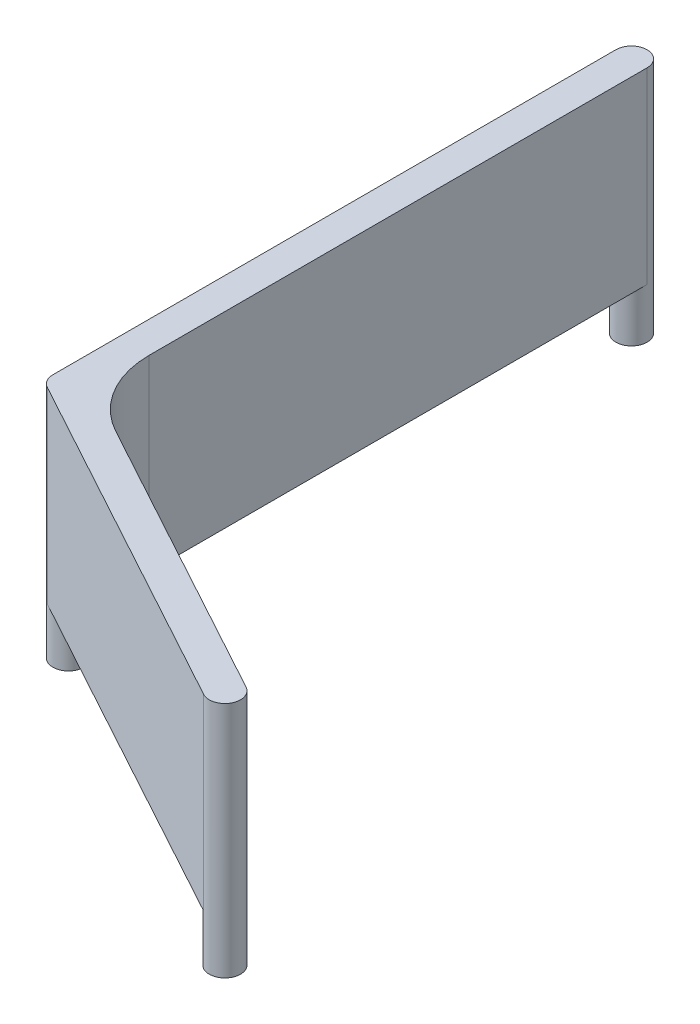
ISO-10303-21;
HEADER;
FILE_DESCRIPTION(('STEP AP214'),'2;1');
FILE_NAME('part.step','',(''),(''),'','','');
FILE_SCHEMA(('AUTOMOTIVE_DESIGN { 1 0 10303 214 1 1 1 1 }'));
ENDSEC;
DATA;
#1=APPLICATION_CONTEXT('core data for automotive mechanical design processes');
#2=APPLICATION_PROTOCOL_DEFINITION('international standard','automotive_design',2000,#1);
#3=PRODUCT_CONTEXT('',#1,'mechanical');
#4=PRODUCT('Part','Part','',(#3));
#5=PRODUCT_RELATED_PRODUCT_CATEGORY('part','',(#4));
#6=PRODUCT_DEFINITION_FORMATION('','',#4);
#7=PRODUCT_DEFINITION_CONTEXT('part definition',#1,'design');
#8=PRODUCT_DEFINITION('design','',#6,#7);
#9=PRODUCT_DEFINITION_SHAPE('','',#8);
#10=(LENGTH_UNIT() NAMED_UNIT(*) SI_UNIT(.MILLI.,.METRE.));
#11=(NAMED_UNIT(*) PLANE_ANGLE_UNIT() SI_UNIT($,.RADIAN.));
#12=(NAMED_UNIT(*) SI_UNIT($,.STERADIAN.) SOLID_ANGLE_UNIT());
#13=UNCERTAINTY_MEASURE_WITH_UNIT(LENGTH_MEASURE(1.E-05),#10,'distance_accuracy_value','');
#14=(GEOMETRIC_REPRESENTATION_CONTEXT(3) GLOBAL_UNCERTAINTY_ASSIGNED_CONTEXT((#13)) GLOBAL_UNIT_ASSIGNED_CONTEXT((#10,
#11,#12)) REPRESENTATION_CONTEXT('',''));
#15=CARTESIAN_POINT('',(0.,0.,0.));
#16=DIRECTION('',(0.,0.,1.));
#17=DIRECTION('',(1.,0.,0.));
#18=AXIS2_PLACEMENT_3D('',#15,#16,#17);
#19=CARTESIAN_POINT('',(0.,0.,0.));
#20=DIRECTION('',(0.,1.,0.));
#21=DIRECTION('',(0.,0.,1.));
#22=AXIS2_PLACEMENT_3D('',#19,#20,#21);
#23=PLANE('',#22);
#24=CARTESIAN_POINT('',(69.85,0.,38.1));
#25=DIRECTION('',(0.,-1.,0.));
#26=DIRECTION('',(0.,0.,-1.));
#27=AXIS2_PLACEMENT_3D('',#24,#25,#26);
#28=CIRCLE('',#27,3.175);
#29=CARTESIAN_POINT('',(68.3296444850892,0.,40.8873184440032));
#30=VERTEX_POINT('',#29);
#31=CARTESIAN_POINT('',(71.3703555149108,0.,35.3126815559968));
#32=VERTEX_POINT('',#31);
#33=EDGE_CURVE('E103',#30,#32,#28,.T.);
#34=ORIENTED_EDGE('',*,*,#33,.F.);
#35=DIRECTION('',(0.877895572914384,0.,0.478852130680573));
#36=VECTOR('',#35,1.);
#37=CARTESIAN_POINT('',(-1.52035551491082,0.,2.78731844400317));
#38=LINE('',#37,#36);
#39=CARTESIAN_POINT('',(-1.52035551491082,0.,2.78731844400317));
#40=VERTEX_POINT('',#39);
#41=EDGE_CURVE('E105',#40,#30,#38,.T.);
#42=ORIENTED_EDGE('',*,*,#41,.F.);
#43=CARTESIAN_POINT('',(0.,0.,0.));
#44=DIRECTION('',(0.,-1.,0.));
#45=DIRECTION('',(0.,0.,-1.));
#46=AXIS2_PLACEMENT_3D('',#43,#44,#45);
#47=CIRCLE('',#46,3.175);
#48=CARTESIAN_POINT('',(-3.175,0.,0.));
#49=VERTEX_POINT('',#48);
#50=EDGE_CURVE('E208',#49,#40,#47,.T.);
#51=ORIENTED_EDGE('',*,*,#50,.F.);
#52=DIRECTION('',(0.,0.,1.));
#53=VECTOR('',#52,1.);
#54=CARTESIAN_POINT('',(-3.175,0.,0.));
#55=LINE('',#54,#53);
#56=CARTESIAN_POINT('',(-3.175,0.,-114.3));
#57=VERTEX_POINT('',#56);
#58=EDGE_CURVE('E158',#57,#49,#55,.T.);
#59=ORIENTED_EDGE('',*,*,#58,.F.);
#60=CARTESIAN_POINT('',(0.,0.,-114.3));
#61=DIRECTION('',(0.,-1.,0.));
#62=DIRECTION('',(0.,0.,-1.));
#63=AXIS2_PLACEMENT_3D('',#60,#61,#62);
#64=CIRCLE('',#63,3.175);
#65=CARTESIAN_POINT('',(3.175,0.,-114.3));
#66=VERTEX_POINT('',#65);
#67=EDGE_CURVE('E155',#66,#57,#64,.T.);
#68=ORIENTED_EDGE('',*,*,#67,.F.);
#69=DIRECTION('',(0.,0.,-1.));
#70=VECTOR('',#69,1.);
#71=CARTESIAN_POINT('',(3.175,0.,-1.88478508849998));
#72=LINE('',#71,#70);
#73=CARTESIAN_POINT('',(3.175,0.,-13.1934956194999));
#74=VERTEX_POINT('',#73);
#75=EDGE_CURVE('E149',#74,#66,#72,.T.);
#76=ORIENTED_EDGE('',*,*,#75,.F.);
#77=CARTESIAN_POINT('',(22.225,0.,-13.1934956194999));
#78=DIRECTION('',(0.,1.,0.));
#79=DIRECTION('',(0.,0.,1.));
#80=AXIS2_PLACEMENT_3D('',#77,#78,#79);
#81=CIRCLE('',#80,19.05);
#82=CARTESIAN_POINT('',(13.1028669105351,0.,3.53041504451916));
#83=VERTEX_POINT('',#82);
#84=EDGE_CURVE('E48',#74,#83,#81,.T.);
#85=ORIENTED_EDGE('',*,*,#84,.T.);
#86=DIRECTION('',(-0.877895572914384,0.,-0.478852130680573));
#87=VECTOR('',#86,1.);
#88=CARTESIAN_POINT('',(3.175,0.,-1.88478508849998));
#89=LINE('',#88,#87);
#90=EDGE_CURVE('E107',#32,#83,#89,.T.);
#91=ORIENTED_EDGE('',*,*,#90,.F.);
#92=EDGE_LOOP('',(#34,#42,#51,#59,#68,#76,#85,#91));
#93=FACE_BOUND('',#92,.T.);
#94=ADVANCED_FACE('F39',(#93),#23,.F.);
#95=CARTESIAN_POINT('',(0.,38.1,0.));
#96=DIRECTION('',(0.,-1.,0.));
#97=DIRECTION('',(0.,0.,-1.));
#98=AXIS2_PLACEMENT_3D('',#95,#96,#97);
#99=CYLINDRICAL_SURFACE('',#98,3.175);
#100=DIRECTION('',(0.,-1.,0.));
#101=VECTOR('',#100,1.);
#102=CARTESIAN_POINT('',(-3.175,38.1,0.));
#103=LINE('',#102,#101);
#104=CARTESIAN_POINT('',(-3.175,38.1,0.));
#105=VERTEX_POINT('',#104);
#106=EDGE_CURVE('E167',#105,#49,#103,.T.);
#107=ORIENTED_EDGE('',*,*,#106,.T.);
#108=ORIENTED_EDGE('',*,*,#50,.T.);
#109=DIRECTION('',(0.,-1.,0.));
#110=VECTOR('',#109,1.);
#111=CARTESIAN_POINT('',(-1.52035551491082,38.1,2.78731844400317));
#112=LINE('',#111,#110);
#113=CARTESIAN_POINT('',(-1.52035551491082,38.1,2.78731844400317));
#114=VERTEX_POINT('',#113);
#115=EDGE_CURVE('E121',#114,#40,#112,.T.);
#116=ORIENTED_EDGE('',*,*,#115,.F.);
#117=CARTESIAN_POINT('',(0.,38.1,0.));
#118=DIRECTION('',(0.,1.,0.));
#119=DIRECTION('',(0.,0.,1.));
#120=AXIS2_PLACEMENT_3D('',#117,#118,#119);
#121=CIRCLE('',#120,3.175);
#122=EDGE_CURVE('E163',#105,#114,#121,.T.);
#123=ORIENTED_EDGE('',*,*,#122,.F.);
#124=EDGE_LOOP('',(#107,#108,#116,#123));
#125=FACE_BOUND('',#124,.T.);
#126=CARTESIAN_POINT('',(0.,-10.16,0.));
#127=DIRECTION('',(0.,-1.,0.));
#128=DIRECTION('',(0.,0.,-1.));
#129=AXIS2_PLACEMENT_3D('',#126,#127,#128);
#130=CIRCLE('',#129,3.175);
#131=CARTESIAN_POINT('',(0.,-10.16,-3.175));
#132=VERTEX_POINT('',#131);
#133=EDGE_CURVE('E204',#132,#132,#130,.T.);
#134=ORIENTED_EDGE('',*,*,#133,.F.);
#135=EDGE_LOOP('',(#134));
#136=FACE_BOUND('',#135,.T.);
#137=ADVANCED_FACE('F227',(#125,#136),#99,.T.);
#138=CARTESIAN_POINT('',(-1.52035551491082,38.1,2.78731844400317));
#139=DIRECTION('',(0.478852130680573,0.,-0.877895572914384));
#140=DIRECTION('',(-0.877895572914384,0.,-0.478852130680573));
#141=AXIS2_PLACEMENT_3D('',#138,#139,#140);
#142=PLANE('',#141);
#143=ORIENTED_EDGE('',*,*,#41,.T.);
#144=DIRECTION('',(0.,-1.,0.));
#145=VECTOR('',#144,1.);
#146=CARTESIAN_POINT('',(68.3296444850892,38.1,40.8873184440032));
#147=LINE('',#146,#145);
#148=CARTESIAN_POINT('',(68.3296444850892,38.1,40.8873184440032));
#149=VERTEX_POINT('',#148);
#150=EDGE_CURVE('E118',#149,#30,#147,.T.);
#151=ORIENTED_EDGE('',*,*,#150,.F.);
#152=DIRECTION('',(0.877895572914384,0.,0.478852130680573));
#153=VECTOR('',#152,1.);
#154=CARTESIAN_POINT('',(-1.52035551491082,38.1,2.78731844400317));
#155=LINE('',#154,#153);
#156=EDGE_CURVE('E196',#114,#149,#155,.T.);
#157=ORIENTED_EDGE('',*,*,#156,.F.);
#158=ORIENTED_EDGE('',*,*,#115,.T.);
#159=EDGE_LOOP('',(#143,#151,#157,#158));
#160=FACE_BOUND('',#159,.T.);
#161=ADVANCED_FACE('F117',(#160),#142,.F.);
#162=CARTESIAN_POINT('',(69.85,38.1,38.1));
#163=DIRECTION('',(0.,-1.,0.));
#164=DIRECTION('',(0.,0.,-1.));
#165=AXIS2_PLACEMENT_3D('',#162,#163,#164);
#166=CYLINDRICAL_SURFACE('',#165,3.175);
#167=ORIENTED_EDGE('',*,*,#150,.T.);
#168=ORIENTED_EDGE('',*,*,#33,.T.);
#169=DIRECTION('',(0.,-1.,0.));
#170=VECTOR('',#169,1.);
#171=CARTESIAN_POINT('',(71.3703555149108,38.1,35.3126815559968));
#172=LINE('',#171,#170);
#173=CARTESIAN_POINT('',(71.3703555149108,38.1,35.3126815559968));
#174=VERTEX_POINT('',#173);
#175=EDGE_CURVE('E129',#174,#32,#172,.T.);
#176=ORIENTED_EDGE('',*,*,#175,.F.);
#177=CARTESIAN_POINT('',(69.85,38.1,38.1));
#178=DIRECTION('',(0.,1.,0.));
#179=DIRECTION('',(0.,0.,1.));
#180=AXIS2_PLACEMENT_3D('',#177,#178,#179);
#181=CIRCLE('',#180,3.175);
#182=EDGE_CURVE('E127',#149,#174,#181,.T.);
#183=ORIENTED_EDGE('',*,*,#182,.F.);
#184=EDGE_LOOP('',(#167,#168,#176,#183));
#185=FACE_BOUND('',#184,.T.);
#186=CARTESIAN_POINT('',(69.85,-10.16,38.1));
#187=DIRECTION('',(0.,-1.,0.));
#188=DIRECTION('',(0.,0.,-1.));
#189=AXIS2_PLACEMENT_3D('',#186,#187,#188);
#190=CIRCLE('',#189,3.175);
#191=CARTESIAN_POINT('',(69.85,-10.16,34.925));
#192=VERTEX_POINT('',#191);
#193=EDGE_CURVE('E113',#192,#192,#190,.T.);
#194=ORIENTED_EDGE('',*,*,#193,.F.);
#195=EDGE_LOOP('',(#194));
#196=FACE_BOUND('',#195,.T.);
#197=ADVANCED_FACE('F125',(#185,#196),#166,.T.);
#198=CARTESIAN_POINT('',(3.175,38.1,-1.88478508849998));
#199=DIRECTION('',(-0.478852130680573,0.,0.877895572914384));
#200=DIRECTION('',(0.877895572914384,0.,0.478852130680573));
#201=AXIS2_PLACEMENT_3D('',#198,#199,#200);
#202=PLANE('',#201);
#203=ORIENTED_EDGE('',*,*,#90,.T.);
#204=DIRECTION('',(0.,-1.,0.));
#205=VECTOR('',#204,1.);
#206=CARTESIAN_POINT('',(13.1028669105351,38.1,3.53041504451916));
#207=LINE('',#206,#205);
#208=CARTESIAN_POINT('',(13.1028669105351,38.1,3.53041504451916));
#209=VERTEX_POINT('',#208);
#210=EDGE_CURVE('E55',#83,#209,#207,.F.);
#211=ORIENTED_EDGE('',*,*,#210,.T.);
#212=DIRECTION('',(-0.877895572914384,0.,-0.478852130680573));
#213=VECTOR('',#212,1.);
#214=CARTESIAN_POINT('',(3.175,38.1,-1.88478508849998));
#215=LINE('',#214,#213);
#216=EDGE_CURVE('E189',#174,#209,#215,.T.);
#217=ORIENTED_EDGE('',*,*,#216,.F.);
#218=ORIENTED_EDGE('',*,*,#175,.T.);
#219=EDGE_LOOP('',(#203,#211,#217,#218));
#220=FACE_BOUND('',#219,.T.);
#221=ADVANCED_FACE('F220',(#220),#202,.F.);
#222=CARTESIAN_POINT('',(3.175,38.1,-1.88478508849998));
#223=DIRECTION('',(-1.,0.,0.));
#224=DIRECTION('',(0.,0.,1.));
#225=AXIS2_PLACEMENT_3D('',#222,#223,#224);
#226=PLANE('',#225);
#227=DIRECTION('',(0.,0.,-1.));
#228=VECTOR('',#227,1.);
#229=CARTESIAN_POINT('',(3.175,38.1,-1.88478508849998));
#230=LINE('',#229,#228);
#231=CARTESIAN_POINT('',(3.175,38.1,-13.1934956194999));
#232=VERTEX_POINT('',#231);
#233=CARTESIAN_POINT('',(3.175,38.1,-114.3));
#234=VERTEX_POINT('',#233);
#235=EDGE_CURVE('E151',#232,#234,#230,.T.);
#236=ORIENTED_EDGE('',*,*,#235,.F.);
#237=DIRECTION('',(0.,-1.,0.));
#238=VECTOR('',#237,1.);
#239=CARTESIAN_POINT('',(3.17500000000001,0.,-13.1934956194999));
#240=LINE('',#239,#238);
#241=EDGE_CURVE('E133',#232,#74,#240,.T.);
#242=ORIENTED_EDGE('',*,*,#241,.T.);
#243=ORIENTED_EDGE('',*,*,#75,.T.);
#244=DIRECTION('',(0.,-1.,0.));
#245=VECTOR('',#244,1.);
#246=CARTESIAN_POINT('',(3.175,38.1,-114.3));
#247=LINE('',#246,#245);
#248=EDGE_CURVE('E135',#234,#66,#247,.T.);
#249=ORIENTED_EDGE('',*,*,#248,.F.);
#250=EDGE_LOOP('',(#236,#242,#243,#249));
#251=FACE_BOUND('',#250,.T.);
#252=ADVANCED_FACE('F147',(#251),#226,.F.);
#253=CARTESIAN_POINT('',(0.,38.1,-114.3));
#254=DIRECTION('',(0.,-1.,0.));
#255=DIRECTION('',(0.,0.,-1.));
#256=AXIS2_PLACEMENT_3D('',#253,#254,#255);
#257=CYLINDRICAL_SURFACE('',#256,3.175);
#258=ORIENTED_EDGE('',*,*,#248,.T.);
#259=ORIENTED_EDGE('',*,*,#67,.T.);
#260=DIRECTION('',(0.,-1.,0.));
#261=VECTOR('',#260,1.);
#262=CARTESIAN_POINT('',(-3.175,38.1,-114.3));
#263=LINE('',#262,#261);
#264=CARTESIAN_POINT('',(-3.175,38.1,-114.3));
#265=VERTEX_POINT('',#264);
#266=EDGE_CURVE('E171',#265,#57,#263,.T.);
#267=ORIENTED_EDGE('',*,*,#266,.F.);
#268=CARTESIAN_POINT('',(0.,38.1,-114.3));
#269=DIRECTION('',(0.,1.,0.));
#270=DIRECTION('',(0.,0.,1.));
#271=AXIS2_PLACEMENT_3D('',#268,#269,#270);
#272=CIRCLE('',#271,3.175);
#273=EDGE_CURVE('E181',#234,#265,#272,.T.);
#274=ORIENTED_EDGE('',*,*,#273,.F.);
#275=EDGE_LOOP('',(#258,#259,#267,#274));
#276=FACE_BOUND('',#275,.T.);
#277=CARTESIAN_POINT('',(0.,-10.16,-114.3));
#278=DIRECTION('',(0.,-1.,0.));
#279=DIRECTION('',(0.,0.,-1.));
#280=AXIS2_PLACEMENT_3D('',#277,#278,#279);
#281=CIRCLE('',#280,3.175);
#282=CARTESIAN_POINT('',(0.,-10.16,-117.475));
#283=VERTEX_POINT('',#282);
#284=EDGE_CURVE('E123',#283,#283,#281,.T.);
#285=ORIENTED_EDGE('',*,*,#284,.F.);
#286=EDGE_LOOP('',(#285));
#287=FACE_BOUND('',#286,.T.);
#288=ADVANCED_FACE('F178',(#276,#287),#257,.T.);
#289=CARTESIAN_POINT('',(-3.175,38.1,0.));
#290=DIRECTION('',(1.,0.,0.));
#291=DIRECTION('',(0.,0.,-1.));
#292=AXIS2_PLACEMENT_3D('',#289,#290,#291);
#293=PLANE('',#292);
#294=ORIENTED_EDGE('',*,*,#58,.T.);
#295=ORIENTED_EDGE('',*,*,#106,.F.);
#296=DIRECTION('',(0.,0.,1.));
#297=VECTOR('',#296,1.);
#298=CARTESIAN_POINT('',(-3.175,38.1,0.));
#299=LINE('',#298,#297);
#300=EDGE_CURVE('E172',#265,#105,#299,.T.);
#301=ORIENTED_EDGE('',*,*,#300,.F.);
#302=ORIENTED_EDGE('',*,*,#266,.T.);
#303=EDGE_LOOP('',(#294,#295,#301,#302));
#304=FACE_BOUND('',#303,.T.);
#305=ADVANCED_FACE('F239',(#304),#293,.F.);
#306=CARTESIAN_POINT('',(0.,38.1,0.));
#307=DIRECTION('',(0.,1.,0.));
#308=DIRECTION('',(0.,0.,1.));
#309=AXIS2_PLACEMENT_3D('',#306,#307,#308);
#310=PLANE('',#309);
#311=ORIENTED_EDGE('',*,*,#122,.T.);
#312=ORIENTED_EDGE('',*,*,#156,.T.);
#313=ORIENTED_EDGE('',*,*,#182,.T.);
#314=ORIENTED_EDGE('',*,*,#216,.T.);
#315=CARTESIAN_POINT('',(22.225,38.1,-13.1934956194999));
#316=DIRECTION('',(0.,1.,0.));
#317=DIRECTION('',(0.,0.,1.));
#318=AXIS2_PLACEMENT_3D('',#315,#316,#317);
#319=CIRCLE('',#318,19.05);
#320=EDGE_CURVE('E11',#209,#232,#319,.F.);
#321=ORIENTED_EDGE('',*,*,#320,.T.);
#322=ORIENTED_EDGE('',*,*,#235,.T.);
#323=ORIENTED_EDGE('',*,*,#273,.T.);
#324=ORIENTED_EDGE('',*,*,#300,.T.);
#325=EDGE_LOOP('',(#311,#312,#313,#314,#321,#322,#323,#324));
#326=FACE_BOUND('',#325,.T.);
#327=ADVANCED_FACE('F237',(#326),#310,.T.);
#328=CARTESIAN_POINT('',(0.,-10.16,-114.3));
#329=DIRECTION('',(0.,-1.,0.));
#330=DIRECTION('',(0.,0.,-1.));
#331=AXIS2_PLACEMENT_3D('',#328,#329,#330);
#332=PLANE('',#331);
#333=ORIENTED_EDGE('',*,*,#284,.T.);
#334=EDGE_LOOP('',(#333));
#335=FACE_BOUND('',#334,.T.);
#336=ADVANCED_FACE('F265',(#335),#332,.T.);
#337=CARTESIAN_POINT('',(0.,-10.16,0.));
#338=DIRECTION('',(0.,-1.,0.));
#339=DIRECTION('',(0.,0.,-1.));
#340=AXIS2_PLACEMENT_3D('',#337,#338,#339);
#341=PLANE('',#340);
#342=ORIENTED_EDGE('',*,*,#133,.T.);
#343=EDGE_LOOP('',(#342));
#344=FACE_BOUND('',#343,.T.);
#345=ADVANCED_FACE('F271',(#344),#341,.T.);
#346=CARTESIAN_POINT('',(69.85,-10.16,38.1));
#347=DIRECTION('',(0.,-1.,0.));
#348=DIRECTION('',(0.,0.,-1.));
#349=AXIS2_PLACEMENT_3D('',#346,#347,#348);
#350=PLANE('',#349);
#351=ORIENTED_EDGE('',*,*,#193,.T.);
#352=EDGE_LOOP('',(#351));
#353=FACE_BOUND('',#352,.T.);
#354=ADVANCED_FACE('F218',(#353),#350,.T.);
#355=CARTESIAN_POINT('',(22.225,38.1,-13.1934956194999));
#356=DIRECTION('',(0.,1.,0.));
#357=DIRECTION('',(0.,0.,1.));
#358=AXIS2_PLACEMENT_3D('',#355,#356,#357);
#359=CYLINDRICAL_SURFACE('',#358,19.05);
#360=ORIENTED_EDGE('',*,*,#320,.F.);
#361=ORIENTED_EDGE('',*,*,#210,.F.);
#362=ORIENTED_EDGE('',*,*,#84,.F.);
#363=ORIENTED_EDGE('',*,*,#241,.F.);
#364=EDGE_LOOP('',(#360,#361,#362,#363));
#365=FACE_BOUND('',#364,.T.);
#366=ADVANCED_FACE('F41',(#365),#359,.F.);
#367=CLOSED_SHELL('',(#94,#137,#161,#197,#221,#252,#288,#305,#327,#336,#345,#354,#366));
#368=MANIFOLD_SOLID_BREP('B2',#367);
#369=ADVANCED_BREP_SHAPE_REPRESENTATION('',(#18,#368),#14);
#370=SHAPE_DEFINITION_REPRESENTATION(#9,#369);
ENDSEC;
END-ISO-10303-21;
